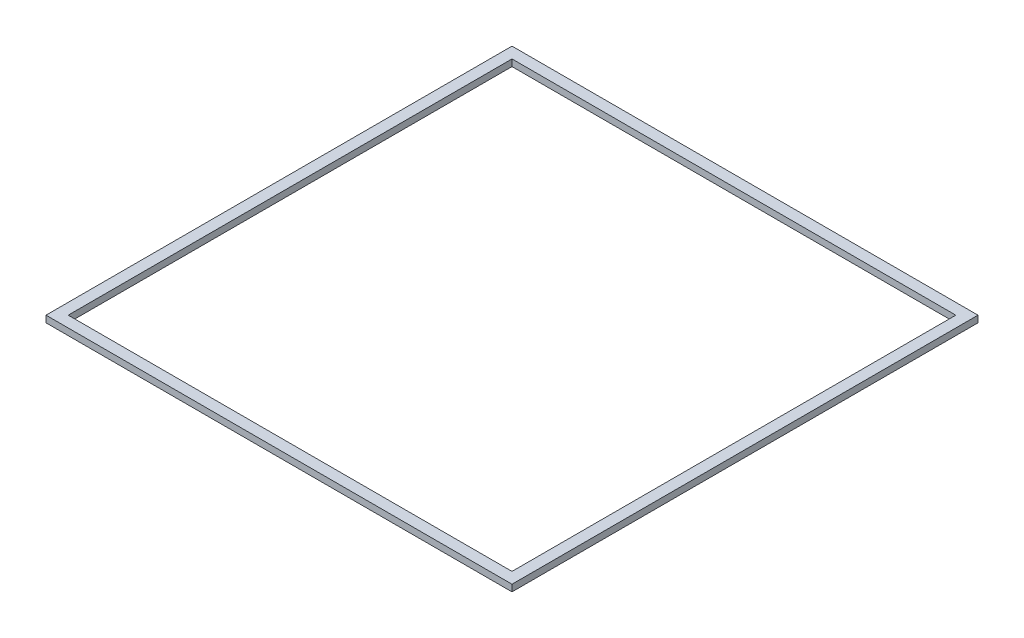
ISO-10303-21;
HEADER;
FILE_DESCRIPTION(('STEP AP214'),'2;1');
FILE_NAME('part.step','',(''),(''),'','','');
FILE_SCHEMA(('AUTOMOTIVE_DESIGN { 1 0 10303 214 1 1 1 1 }'));
ENDSEC;
DATA;
#1=APPLICATION_CONTEXT('core data for automotive mechanical design processes');
#2=APPLICATION_PROTOCOL_DEFINITION('international standard','automotive_design',2000,#1);
#3=PRODUCT_CONTEXT('',#1,'mechanical');
#4=PRODUCT('Part','Part','',(#3));
#5=PRODUCT_RELATED_PRODUCT_CATEGORY('part','',(#4));
#6=PRODUCT_DEFINITION_FORMATION('','',#4);
#7=PRODUCT_DEFINITION_CONTEXT('part definition',#1,'design');
#8=PRODUCT_DEFINITION('design','',#6,#7);
#9=PRODUCT_DEFINITION_SHAPE('','',#8);
#10=(LENGTH_UNIT() NAMED_UNIT(*) SI_UNIT(.MILLI.,.METRE.));
#11=(NAMED_UNIT(*) PLANE_ANGLE_UNIT() SI_UNIT($,.RADIAN.));
#12=(NAMED_UNIT(*) SI_UNIT($,.STERADIAN.) SOLID_ANGLE_UNIT());
#13=UNCERTAINTY_MEASURE_WITH_UNIT(LENGTH_MEASURE(1.E-05),#10,'distance_accuracy_value','');
#14=(GEOMETRIC_REPRESENTATION_CONTEXT(3) GLOBAL_UNCERTAINTY_ASSIGNED_CONTEXT((#13)) GLOBAL_UNIT_ASSIGNED_CONTEXT((#10,
#11,#12)) REPRESENTATION_CONTEXT('',''));
#15=CARTESIAN_POINT('',(0.,0.,0.));
#16=DIRECTION('',(0.,0.,1.));
#17=DIRECTION('',(1.,0.,0.));
#18=AXIS2_PLACEMENT_3D('',#15,#16,#17);
#19=CARTESIAN_POINT('',(0.,3.,0.));
#20=DIRECTION('',(0.,-1.,0.));
#21=DIRECTION('',(0.,0.,-1.));
#22=AXIS2_PLACEMENT_3D('',#19,#20,#21);
#23=PLANE('',#22);
#24=DIRECTION('',(0.,0.,1.));
#25=VECTOR('',#24,1.);
#26=CARTESIAN_POINT('',(0.,3.,-27.2900357662725));
#27=LINE('',#26,#25);
#28=CARTESIAN_POINT('',(0.,3.,-237.290035766273));
#29=VERTEX_POINT('',#28);
#30=CARTESIAN_POINT('',(0.,3.,-27.2900357662725));
#31=VERTEX_POINT('',#30);
#32=EDGE_CURVE('E138',#29,#31,#27,.T.);
#33=ORIENTED_EDGE('',*,*,#32,.T.);
#34=DIRECTION('',(1.,0.,0.));
#35=VECTOR('',#34,1.);
#36=CARTESIAN_POINT('',(0.,3.,-27.2900357662725));
#37=LINE('',#36,#35);
#38=CARTESIAN_POINT('',(210.,3.,-27.2900357662725));
#39=VERTEX_POINT('',#38);
#40=EDGE_CURVE('E141',#31,#39,#37,.T.);
#41=ORIENTED_EDGE('',*,*,#40,.T.);
#42=DIRECTION('',(0.,0.,-1.));
#43=VECTOR('',#42,1.);
#44=CARTESIAN_POINT('',(210.,3.,-27.2900357662725));
#45=LINE('',#44,#43);
#46=CARTESIAN_POINT('',(210.,3.,-237.290035766273));
#47=VERTEX_POINT('',#46);
#48=EDGE_CURVE('E144',#39,#47,#45,.T.);
#49=ORIENTED_EDGE('',*,*,#48,.T.);
#50=DIRECTION('',(-1.,0.,0.));
#51=VECTOR('',#50,1.);
#52=CARTESIAN_POINT('',(0.,3.,-237.290035766273));
#53=LINE('',#52,#51);
#54=EDGE_CURVE('E146',#47,#29,#53,.T.);
#55=ORIENTED_EDGE('',*,*,#54,.T.);
#56=EDGE_LOOP('',(#33,#41,#49,#55));
#57=FACE_BOUND('',#56,.T.);
#58=DIRECTION('',(0.,0.,1.));
#59=VECTOR('',#58,1.);
#60=CARTESIAN_POINT('',(5.,3.,-232.290035766273));
#61=LINE('',#60,#59);
#62=CARTESIAN_POINT('',(5.,3.,-232.290035766273));
#63=VERTEX_POINT('',#62);
#64=CARTESIAN_POINT('',(5.00000000000002,3.,-32.2900357662725));
#65=VERTEX_POINT('',#64);
#66=EDGE_CURVE('E102',#63,#65,#61,.T.);
#67=ORIENTED_EDGE('',*,*,#66,.F.);
#68=DIRECTION('',(-1.,0.,0.));
#69=VECTOR('',#68,1.);
#70=CARTESIAN_POINT('',(5.,3.,-232.290035766273));
#71=LINE('',#70,#69);
#72=CARTESIAN_POINT('',(205.,3.,-232.290035766273));
#73=VERTEX_POINT('',#72);
#74=EDGE_CURVE('E124',#73,#63,#71,.T.);
#75=ORIENTED_EDGE('',*,*,#74,.F.);
#76=DIRECTION('',(0.,0.,-1.));
#77=VECTOR('',#76,1.);
#78=CARTESIAN_POINT('',(205.,3.,-232.290035766273));
#79=LINE('',#78,#77);
#80=CARTESIAN_POINT('',(205.,3.,-32.2900357662725));
#81=VERTEX_POINT('',#80);
#82=EDGE_CURVE('E122',#81,#73,#79,.T.);
#83=ORIENTED_EDGE('',*,*,#82,.F.);
#84=DIRECTION('',(1.,0.,0.));
#85=VECTOR('',#84,1.);
#86=CARTESIAN_POINT('',(5.00000000000002,3.,-32.2900357662725));
#87=LINE('',#86,#85);
#88=EDGE_CURVE('E110',#65,#81,#87,.T.);
#89=ORIENTED_EDGE('',*,*,#88,.F.);
#90=EDGE_LOOP('',(#67,#75,#83,#89));
#91=FACE_BOUND('',#90,.T.);
#92=ADVANCED_FACE('F37',(#57,#91),#23,.F.);
#93=CARTESIAN_POINT('',(0.,0.,0.));
#94=DIRECTION('',(0.,-1.,0.));
#95=DIRECTION('',(0.,0.,-1.));
#96=AXIS2_PLACEMENT_3D('',#93,#94,#95);
#97=PLANE('',#96);
#98=DIRECTION('',(0.,0.,1.));
#99=VECTOR('',#98,1.);
#100=CARTESIAN_POINT('',(0.,0.,-27.2900357662725));
#101=LINE('',#100,#99);
#102=CARTESIAN_POINT('',(0.,0.,-237.290035766273));
#103=VERTEX_POINT('',#102);
#104=CARTESIAN_POINT('',(0.,0.,-27.2900357662725));
#105=VERTEX_POINT('',#104);
#106=EDGE_CURVE('E118',#103,#105,#101,.T.);
#107=ORIENTED_EDGE('',*,*,#106,.F.);
#108=DIRECTION('',(-1.,0.,0.));
#109=VECTOR('',#108,1.);
#110=CARTESIAN_POINT('',(0.,0.,-237.290035766273));
#111=LINE('',#110,#109);
#112=CARTESIAN_POINT('',(210.,0.,-237.290035766273));
#113=VERTEX_POINT('',#112);
#114=EDGE_CURVE('E142',#113,#103,#111,.T.);
#115=ORIENTED_EDGE('',*,*,#114,.F.);
#116=DIRECTION('',(0.,0.,-1.));
#117=VECTOR('',#116,1.);
#118=CARTESIAN_POINT('',(210.,0.,-27.2900357662725));
#119=LINE('',#118,#117);
#120=CARTESIAN_POINT('',(210.,0.,-27.2900357662725));
#121=VERTEX_POINT('',#120);
#122=EDGE_CURVE('E153',#121,#113,#119,.T.);
#123=ORIENTED_EDGE('',*,*,#122,.F.);
#124=DIRECTION('',(1.,0.,0.));
#125=VECTOR('',#124,1.);
#126=CARTESIAN_POINT('',(0.,0.,-27.2900357662725));
#127=LINE('',#126,#125);
#128=EDGE_CURVE('E151',#105,#121,#127,.T.);
#129=ORIENTED_EDGE('',*,*,#128,.F.);
#130=EDGE_LOOP('',(#107,#115,#123,#129));
#131=FACE_BOUND('',#130,.T.);
#132=DIRECTION('',(-1.,0.,0.));
#133=VECTOR('',#132,1.);
#134=CARTESIAN_POINT('',(5.,0.,-232.290035766273));
#135=LINE('',#134,#133);
#136=CARTESIAN_POINT('',(205.,0.,-232.290035766273));
#137=VERTEX_POINT('',#136);
#138=CARTESIAN_POINT('',(5.,0.,-232.290035766273));
#139=VERTEX_POINT('',#138);
#140=EDGE_CURVE('E111',#137,#139,#135,.T.);
#141=ORIENTED_EDGE('',*,*,#140,.T.);
#142=DIRECTION('',(0.,0.,1.));
#143=VECTOR('',#142,1.);
#144=CARTESIAN_POINT('',(5.,0.,-232.290035766273));
#145=LINE('',#144,#143);
#146=CARTESIAN_POINT('',(5.00000000000002,0.,-32.2900357662725));
#147=VERTEX_POINT('',#146);
#148=EDGE_CURVE('E60',#139,#147,#145,.T.);
#149=ORIENTED_EDGE('',*,*,#148,.T.);
#150=DIRECTION('',(1.,0.,0.));
#151=VECTOR('',#150,1.);
#152=CARTESIAN_POINT('',(5.00000000000002,0.,-32.2900357662725));
#153=LINE('',#152,#151);
#154=CARTESIAN_POINT('',(205.,0.,-32.2900357662725));
#155=VERTEX_POINT('',#154);
#156=EDGE_CURVE('E117',#147,#155,#153,.T.);
#157=ORIENTED_EDGE('',*,*,#156,.T.);
#158=DIRECTION('',(0.,0.,-1.));
#159=VECTOR('',#158,1.);
#160=CARTESIAN_POINT('',(205.,0.,-232.290035766273));
#161=LINE('',#160,#159);
#162=EDGE_CURVE('E130',#155,#137,#161,.T.);
#163=ORIENTED_EDGE('',*,*,#162,.T.);
#164=EDGE_LOOP('',(#141,#149,#157,#163));
#165=FACE_BOUND('',#164,.T.);
#166=ADVANCED_FACE('F171',(#131,#165),#97,.T.);
#167=CARTESIAN_POINT('',(0.,3.,-27.2900357662725));
#168=DIRECTION('',(1.,0.,0.));
#169=DIRECTION('',(0.,0.,-1.));
#170=AXIS2_PLACEMENT_3D('',#167,#168,#169);
#171=PLANE('',#170);
#172=ORIENTED_EDGE('',*,*,#106,.T.);
#173=DIRECTION('',(0.,-1.,0.));
#174=VECTOR('',#173,1.);
#175=CARTESIAN_POINT('',(0.,3.,-27.2900357662725));
#176=LINE('',#175,#174);
#177=EDGE_CURVE('E11',#31,#105,#176,.T.);
#178=ORIENTED_EDGE('',*,*,#177,.F.);
#179=ORIENTED_EDGE('',*,*,#32,.F.);
#180=DIRECTION('',(0.,-1.,0.));
#181=VECTOR('',#180,1.);
#182=CARTESIAN_POINT('',(0.,3.,-237.290035766273));
#183=LINE('',#182,#181);
#184=EDGE_CURVE('E148',#29,#103,#183,.T.);
#185=ORIENTED_EDGE('',*,*,#184,.T.);
#186=EDGE_LOOP('',(#172,#178,#179,#185));
#187=FACE_BOUND('',#186,.T.);
#188=ADVANCED_FACE('F39',(#187),#171,.F.);
#189=CARTESIAN_POINT('',(0.,3.,-27.2900357662725));
#190=DIRECTION('',(0.,0.,-1.));
#191=DIRECTION('',(-1.,0.,0.));
#192=AXIS2_PLACEMENT_3D('',#189,#190,#191);
#193=PLANE('',#192);
#194=ORIENTED_EDGE('',*,*,#128,.T.);
#195=DIRECTION('',(0.,-1.,0.));
#196=VECTOR('',#195,1.);
#197=CARTESIAN_POINT('',(210.,3.,-27.2900357662725));
#198=LINE('',#197,#196);
#199=EDGE_CURVE('E45',#39,#121,#198,.T.);
#200=ORIENTED_EDGE('',*,*,#199,.F.);
#201=ORIENTED_EDGE('',*,*,#40,.F.);
#202=ORIENTED_EDGE('',*,*,#177,.T.);
#203=EDGE_LOOP('',(#194,#200,#201,#202));
#204=FACE_BOUND('',#203,.T.);
#205=ADVANCED_FACE('F181',(#204),#193,.F.);
#206=CARTESIAN_POINT('',(210.,3.,-27.2900357662725));
#207=DIRECTION('',(-1.,0.,0.));
#208=DIRECTION('',(0.,0.,1.));
#209=AXIS2_PLACEMENT_3D('',#206,#207,#208);
#210=PLANE('',#209);
#211=ORIENTED_EDGE('',*,*,#122,.T.);
#212=DIRECTION('',(0.,-1.,0.));
#213=VECTOR('',#212,1.);
#214=CARTESIAN_POINT('',(210.,3.,-237.290035766273));
#215=LINE('',#214,#213);
#216=EDGE_CURVE('E158',#47,#113,#215,.T.);
#217=ORIENTED_EDGE('',*,*,#216,.F.);
#218=ORIENTED_EDGE('',*,*,#48,.F.);
#219=ORIENTED_EDGE('',*,*,#199,.T.);
#220=EDGE_LOOP('',(#211,#217,#218,#219));
#221=FACE_BOUND('',#220,.T.);
#222=ADVANCED_FACE('F165',(#221),#210,.F.);
#223=CARTESIAN_POINT('',(0.,3.,-237.290035766273));
#224=DIRECTION('',(0.,0.,1.));
#225=DIRECTION('',(1.,0.,0.));
#226=AXIS2_PLACEMENT_3D('',#223,#224,#225);
#227=PLANE('',#226);
#228=ORIENTED_EDGE('',*,*,#114,.T.);
#229=ORIENTED_EDGE('',*,*,#184,.F.);
#230=ORIENTED_EDGE('',*,*,#54,.F.);
#231=ORIENTED_EDGE('',*,*,#216,.T.);
#232=EDGE_LOOP('',(#228,#229,#230,#231));
#233=FACE_BOUND('',#232,.T.);
#234=ADVANCED_FACE('F175',(#233),#227,.F.);
#235=CARTESIAN_POINT('',(5.,3.,-232.290035766273));
#236=DIRECTION('',(1.,0.,0.));
#237=DIRECTION('',(0.,0.,-1.));
#238=AXIS2_PLACEMENT_3D('',#235,#236,#237);
#239=PLANE('',#238);
#240=ORIENTED_EDGE('',*,*,#148,.F.);
#241=DIRECTION('',(0.,-1.,0.));
#242=VECTOR('',#241,1.);
#243=CARTESIAN_POINT('',(5.,3.,-232.290035766273));
#244=LINE('',#243,#242);
#245=EDGE_CURVE('E106',#63,#139,#244,.T.);
#246=ORIENTED_EDGE('',*,*,#245,.F.);
#247=ORIENTED_EDGE('',*,*,#66,.T.);
#248=DIRECTION('',(0.,-1.,0.));
#249=VECTOR('',#248,1.);
#250=CARTESIAN_POINT('',(5.00000000000002,3.,-32.2900357662725));
#251=LINE('',#250,#249);
#252=EDGE_CURVE('E105',#65,#147,#251,.T.);
#253=ORIENTED_EDGE('',*,*,#252,.T.);
#254=EDGE_LOOP('',(#240,#246,#247,#253));
#255=FACE_BOUND('',#254,.T.);
#256=ADVANCED_FACE('F104',(#255),#239,.T.);
#257=CARTESIAN_POINT('',(5.00000000000002,3.,-32.2900357662725));
#258=DIRECTION('',(0.,0.,-1.));
#259=DIRECTION('',(-1.,0.,0.));
#260=AXIS2_PLACEMENT_3D('',#257,#258,#259);
#261=PLANE('',#260);
#262=ORIENTED_EDGE('',*,*,#156,.F.);
#263=ORIENTED_EDGE('',*,*,#252,.F.);
#264=ORIENTED_EDGE('',*,*,#88,.T.);
#265=DIRECTION('',(0.,-1.,0.));
#266=VECTOR('',#265,1.);
#267=CARTESIAN_POINT('',(205.,3.,-32.2900357662725));
#268=LINE('',#267,#266);
#269=EDGE_CURVE('E119',#81,#155,#268,.T.);
#270=ORIENTED_EDGE('',*,*,#269,.T.);
#271=EDGE_LOOP('',(#262,#263,#264,#270));
#272=FACE_BOUND('',#271,.T.);
#273=ADVANCED_FACE('F114',(#272),#261,.T.);
#274=CARTESIAN_POINT('',(205.,3.,-232.290035766273));
#275=DIRECTION('',(-1.,0.,0.));
#276=DIRECTION('',(0.,0.,1.));
#277=AXIS2_PLACEMENT_3D('',#274,#275,#276);
#278=PLANE('',#277);
#279=ORIENTED_EDGE('',*,*,#162,.F.);
#280=ORIENTED_EDGE('',*,*,#269,.F.);
#281=ORIENTED_EDGE('',*,*,#82,.T.);
#282=DIRECTION('',(0.,-1.,0.));
#283=VECTOR('',#282,1.);
#284=CARTESIAN_POINT('',(205.,3.,-232.290035766273));
#285=LINE('',#284,#283);
#286=EDGE_CURVE('E52',#73,#137,#285,.T.);
#287=ORIENTED_EDGE('',*,*,#286,.T.);
#288=EDGE_LOOP('',(#279,#280,#281,#287));
#289=FACE_BOUND('',#288,.T.);
#290=ADVANCED_FACE('F204',(#289),#278,.T.);
#291=CARTESIAN_POINT('',(5.,3.,-232.290035766273));
#292=DIRECTION('',(0.,0.,1.));
#293=DIRECTION('',(1.,0.,0.));
#294=AXIS2_PLACEMENT_3D('',#291,#292,#293);
#295=PLANE('',#294);
#296=ORIENTED_EDGE('',*,*,#140,.F.);
#297=ORIENTED_EDGE('',*,*,#286,.F.);
#298=ORIENTED_EDGE('',*,*,#74,.T.);
#299=ORIENTED_EDGE('',*,*,#245,.T.);
#300=EDGE_LOOP('',(#296,#297,#298,#299));
#301=FACE_BOUND('',#300,.T.);
#302=ADVANCED_FACE('F208',(#301),#295,.T.);
#303=CLOSED_SHELL('',(#92,#166,#188,#205,#222,#234,#256,#273,#290,#302));
#304=MANIFOLD_SOLID_BREP('B2',#303);
#305=ADVANCED_BREP_SHAPE_REPRESENTATION('',(#18,#304),#14);
#306=SHAPE_DEFINITION_REPRESENTATION(#9,#305);
ENDSEC;
END-ISO-10303-21;
